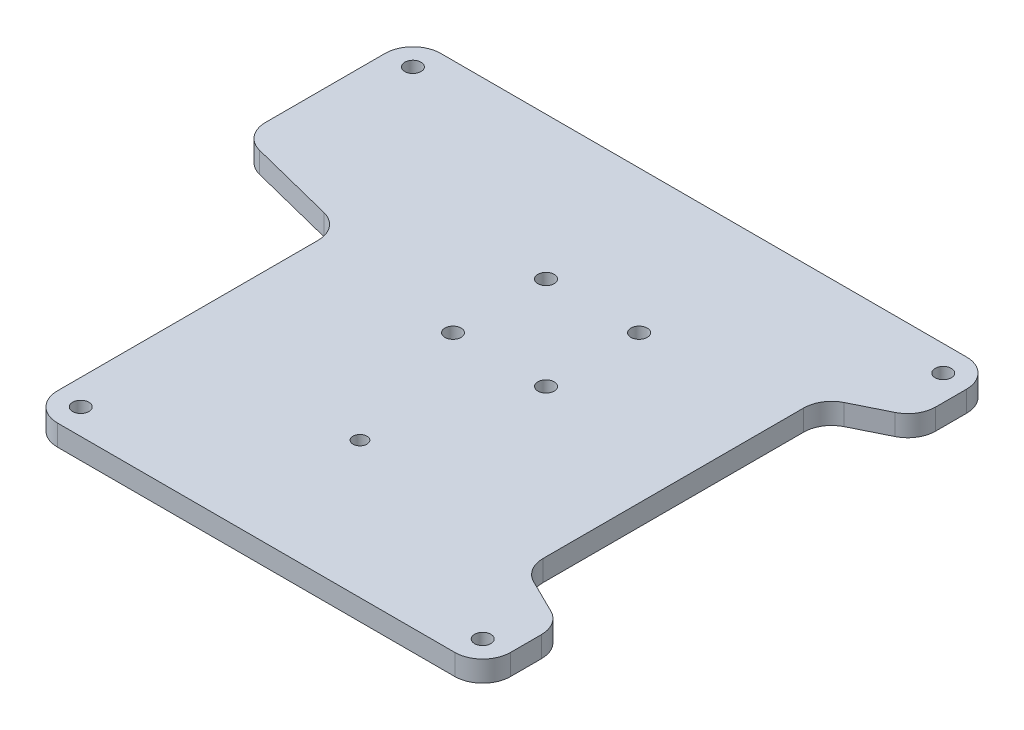
ISO-10303-21;
HEADER;
FILE_DESCRIPTION(('STEP AP214'),'2;1');
FILE_NAME('part.step','',(''),(''),'','','');
FILE_SCHEMA(('AUTOMOTIVE_DESIGN { 1 0 10303 214 1 1 1 1 }'));
ENDSEC;
DATA;
#1=APPLICATION_CONTEXT('core data for automotive mechanical design processes');
#2=APPLICATION_PROTOCOL_DEFINITION('international standard','automotive_design',2000,#1);
#3=PRODUCT_CONTEXT('',#1,'mechanical');
#4=PRODUCT('Part','Part','',(#3));
#5=PRODUCT_RELATED_PRODUCT_CATEGORY('part','',(#4));
#6=PRODUCT_DEFINITION_FORMATION('','',#4);
#7=PRODUCT_DEFINITION_CONTEXT('part definition',#1,'design');
#8=PRODUCT_DEFINITION('design','',#6,#7);
#9=PRODUCT_DEFINITION_SHAPE('','',#8);
#10=(LENGTH_UNIT() NAMED_UNIT(*) SI_UNIT(.MILLI.,.METRE.));
#11=(NAMED_UNIT(*) PLANE_ANGLE_UNIT() SI_UNIT($,.RADIAN.));
#12=(NAMED_UNIT(*) SI_UNIT($,.STERADIAN.) SOLID_ANGLE_UNIT());
#13=UNCERTAINTY_MEASURE_WITH_UNIT(LENGTH_MEASURE(1.E-05),#10,'distance_accuracy_value','');
#14=(GEOMETRIC_REPRESENTATION_CONTEXT(3) GLOBAL_UNCERTAINTY_ASSIGNED_CONTEXT((#13)) GLOBAL_UNIT_ASSIGNED_CONTEXT((#10,
#11,#12)) REPRESENTATION_CONTEXT('',''));
#15=CARTESIAN_POINT('',(0.,0.,0.));
#16=DIRECTION('',(0.,0.,1.));
#17=DIRECTION('',(1.,0.,0.));
#18=AXIS2_PLACEMENT_3D('',#15,#16,#17);
#19=CARTESIAN_POINT('',(-35.7,4.5,49.));
#20=DIRECTION('',(0.,1.,0.));
#21=DIRECTION('',(0.,0.,1.));
#22=AXIS2_PLACEMENT_3D('',#19,#20,#21);
#23=PLANE('',#22);
#24=CARTESIAN_POINT('',(10.,4.5,-24.3180573966395));
#25=DIRECTION('',(0.,1.,0.));
#26=DIRECTION('',(0.,0.,1.));
#27=AXIS2_PLACEMENT_3D('',#24,#25,#26);
#28=CIRCLE('',#27,1.75);
#29=CARTESIAN_POINT('',(10.,4.5,-22.5680573966395));
#30=VERTEX_POINT('',#29);
#31=EDGE_CURVE('E523',#30,#30,#28,.T.);
#32=ORIENTED_EDGE('',*,*,#31,.F.);
#33=EDGE_LOOP('',(#32));
#34=FACE_BOUND('',#33,.T.);
#35=CARTESIAN_POINT('',(-10.,4.5,-4.31805739663951));
#36=DIRECTION('',(0.,1.,0.));
#37=DIRECTION('',(0.,0.,1.));
#38=AXIS2_PLACEMENT_3D('',#35,#36,#37);
#39=CIRCLE('',#38,1.75);
#40=CARTESIAN_POINT('',(-10.,4.5,-2.56805739663951));
#41=VERTEX_POINT('',#40);
#42=EDGE_CURVE('E539',#41,#41,#39,.T.);
#43=ORIENTED_EDGE('',*,*,#42,.F.);
#44=EDGE_LOOP('',(#43));
#45=FACE_BOUND('',#44,.T.);
#46=CARTESIAN_POINT('',(50.2,4.5,-49.5));
#47=DIRECTION('',(0.,1.,0.));
#48=DIRECTION('',(0.,0.,1.));
#49=AXIS2_PLACEMENT_3D('',#46,#47,#48);
#50=CIRCLE('',#49,1.75);
#51=CARTESIAN_POINT('',(50.2,4.5,-47.75));
#52=VERTEX_POINT('',#51);
#53=EDGE_CURVE('E554',#52,#52,#50,.T.);
#54=ORIENTED_EDGE('',*,*,#53,.F.);
#55=EDGE_LOOP('',(#54));
#56=FACE_BOUND('',#55,.T.);
#57=CARTESIAN_POINT('',(50.2,4.5,49.5));
#58=DIRECTION('',(0.,1.,0.));
#59=DIRECTION('',(0.,0.,1.));
#60=AXIS2_PLACEMENT_3D('',#57,#58,#59);
#61=CIRCLE('',#60,1.75);
#62=CARTESIAN_POINT('',(50.2,4.5,51.25));
#63=VERTEX_POINT('',#62);
#64=EDGE_CURVE('E570',#63,#63,#61,.T.);
#65=ORIENTED_EDGE('',*,*,#64,.F.);
#66=EDGE_LOOP('',(#65));
#67=FACE_BOUND('',#66,.T.);
#68=CARTESIAN_POINT('',(-35.7,4.5,49.));
#69=DIRECTION('',(0.,1.,0.));
#70=DIRECTION('',(0.,0.,1.));
#71=AXIS2_PLACEMENT_3D('',#68,#69,#70);
#72=CIRCLE('',#71,6.00000000000001);
#73=CARTESIAN_POINT('',(-41.7,4.5,49.));
#74=VERTEX_POINT('',#73);
#75=CARTESIAN_POINT('',(-35.7,4.5,55.));
#76=VERTEX_POINT('',#75);
#77=EDGE_CURVE('E312',#74,#76,#72,.T.);
#78=ORIENTED_EDGE('',*,*,#77,.T.);
#79=DIRECTION('',(1.,0.,0.));
#80=VECTOR('',#79,1.);
#81=CARTESIAN_POINT('',(-35.7,4.5,55.));
#82=LINE('',#81,#80);
#83=CARTESIAN_POINT('',(49.7,4.5,55.));
#84=VERTEX_POINT('',#83);
#85=EDGE_CURVE('E162',#76,#84,#82,.T.);
#86=ORIENTED_EDGE('',*,*,#85,.T.);
#87=CARTESIAN_POINT('',(49.7,4.5,49.));
#88=DIRECTION('',(0.,1.,0.));
#89=DIRECTION('',(0.,0.,1.));
#90=AXIS2_PLACEMENT_3D('',#87,#88,#89);
#91=CIRCLE('',#90,5.99999999999999);
#92=CARTESIAN_POINT('',(55.7,4.5,49.));
#93=VERTEX_POINT('',#92);
#94=EDGE_CURVE('E383',#84,#93,#91,.T.);
#95=ORIENTED_EDGE('',*,*,#94,.T.);
#96=DIRECTION('',(0.,0.,-1.));
#97=VECTOR('',#96,1.);
#98=CARTESIAN_POINT('',(55.7,4.5,49.));
#99=LINE('',#98,#97);
#100=CARTESIAN_POINT('',(55.7,4.5,42.3778187247569));
#101=VERTEX_POINT('',#100);
#102=EDGE_CURVE('E403',#93,#101,#99,.T.);
#103=ORIENTED_EDGE('',*,*,#102,.T.);
#104=CARTESIAN_POINT('',(49.7,4.5,42.3778187247569));
#105=DIRECTION('',(0.,1.,0.));
#106=DIRECTION('',(0.,0.,1.));
#107=AXIS2_PLACEMENT_3D('',#104,#105,#106);
#108=CIRCLE('',#107,6.);
#109=CARTESIAN_POINT('',(52.3606513795788,4.5,37.));
#110=VERTEX_POINT('',#109);
#111=EDGE_CURVE('E399',#101,#110,#108,.T.);
#112=ORIENTED_EDGE('',*,*,#111,.T.);
#113=DIRECTION('',(-0.896303120792812,0.,-0.443441896596461));
#114=VECTOR('',#113,1.);
#115=CARTESIAN_POINT('',(52.3606513795788,4.5,37.));
#116=LINE('',#115,#114);
#117=CARTESIAN_POINT('',(45.0393486204213,4.5,33.3778187247569));
#118=VERTEX_POINT('',#117);
#119=EDGE_CURVE('E402',#110,#118,#116,.T.);
#120=ORIENTED_EDGE('',*,*,#119,.T.);
#121=CARTESIAN_POINT('',(47.7,4.5,28.));
#122=DIRECTION('',(0.,-1.,0.));
#123=DIRECTION('',(0.,0.,-1.));
#124=AXIS2_PLACEMENT_3D('',#121,#122,#123);
#125=CIRCLE('',#124,6.00000000000001);
#126=CARTESIAN_POINT('',(41.7,4.5,28.));
#127=VERTEX_POINT('',#126);
#128=EDGE_CURVE('E406',#118,#127,#125,.T.);
#129=ORIENTED_EDGE('',*,*,#128,.T.);
#130=DIRECTION('',(0.,0.,-1.));
#131=VECTOR('',#130,1.);
#132=CARTESIAN_POINT('',(41.7,4.5,28.));
#133=LINE('',#132,#131);
#134=CARTESIAN_POINT('',(41.7,4.5,-28.));
#135=VERTEX_POINT('',#134);
#136=EDGE_CURVE('E414',#127,#135,#133,.T.);
#137=ORIENTED_EDGE('',*,*,#136,.T.);
#138=CARTESIAN_POINT('',(47.7,4.5,-28.));
#139=DIRECTION('',(0.,-1.,0.));
#140=DIRECTION('',(0.,0.,-1.));
#141=AXIS2_PLACEMENT_3D('',#138,#139,#140);
#142=CIRCLE('',#141,6.);
#143=CARTESIAN_POINT('',(45.0393486204212,4.5,-33.3778187247569));
#144=VERTEX_POINT('',#143);
#145=EDGE_CURVE('E417',#135,#144,#142,.T.);
#146=ORIENTED_EDGE('',*,*,#145,.T.);
#147=DIRECTION('',(0.896303120792812,0.,-0.443441896596461));
#148=VECTOR('',#147,1.);
#149=CARTESIAN_POINT('',(45.0393486204213,4.5,-33.3778187247569));
#150=LINE('',#149,#148);
#151=CARTESIAN_POINT('',(52.3606513795788,4.5,-37.));
#152=VERTEX_POINT('',#151);
#153=EDGE_CURVE('E420',#144,#152,#150,.T.);
#154=ORIENTED_EDGE('',*,*,#153,.T.);
#155=CARTESIAN_POINT('',(49.7,4.5,-42.3778187247569));
#156=DIRECTION('',(0.,1.,0.));
#157=DIRECTION('',(0.,0.,1.));
#158=AXIS2_PLACEMENT_3D('',#155,#156,#157);
#159=CIRCLE('',#158,6.);
#160=CARTESIAN_POINT('',(55.7,4.5,-42.3778187247569));
#161=VERTEX_POINT('',#160);
#162=EDGE_CURVE('E423',#152,#161,#159,.T.);
#163=ORIENTED_EDGE('',*,*,#162,.T.);
#164=DIRECTION('',(0.,0.,-1.));
#165=VECTOR('',#164,1.);
#166=CARTESIAN_POINT('',(55.7,4.5,-42.3778187247569));
#167=LINE('',#166,#165);
#168=CARTESIAN_POINT('',(55.7,4.5,-49.));
#169=VERTEX_POINT('',#168);
#170=EDGE_CURVE('E426',#161,#169,#167,.T.);
#171=ORIENTED_EDGE('',*,*,#170,.T.);
#172=CARTESIAN_POINT('',(49.7,4.5,-49.));
#173=DIRECTION('',(0.,1.,0.));
#174=DIRECTION('',(0.,0.,1.));
#175=AXIS2_PLACEMENT_3D('',#172,#173,#174);
#176=CIRCLE('',#175,6.);
#177=CARTESIAN_POINT('',(49.7,4.5,-55.));
#178=VERTEX_POINT('',#177);
#179=EDGE_CURVE('E429',#169,#178,#176,.T.);
#180=ORIENTED_EDGE('',*,*,#179,.T.);
#181=DIRECTION('',(-1.,0.,0.));
#182=VECTOR('',#181,1.);
#183=CARTESIAN_POINT('',(49.7,4.5,-55.));
#184=LINE('',#183,#182);
#185=CARTESIAN_POINT('',(-63.3,4.5,-55.));
#186=VERTEX_POINT('',#185);
#187=EDGE_CURVE('E432',#178,#186,#184,.T.);
#188=ORIENTED_EDGE('',*,*,#187,.T.);
#189=CARTESIAN_POINT('',(-63.3,4.5,-49.));
#190=DIRECTION('',(0.,1.,0.));
#191=DIRECTION('',(0.,0.,1.));
#192=AXIS2_PLACEMENT_3D('',#189,#190,#191);
#193=CIRCLE('',#192,6.00000000000001);
#194=CARTESIAN_POINT('',(-69.3,4.5,-49.));
#195=VERTEX_POINT('',#194);
#196=EDGE_CURVE('E435',#186,#195,#193,.T.);
#197=ORIENTED_EDGE('',*,*,#196,.T.);
#198=DIRECTION('',(0.,0.,1.));
#199=VECTOR('',#198,1.);
#200=CARTESIAN_POINT('',(-69.3,4.5,-49.));
#201=LINE('',#200,#199);
#202=CARTESIAN_POINT('',(-69.3,4.5,-23.317292810075));
#203=VERTEX_POINT('',#202);
#204=EDGE_CURVE('E438',#195,#203,#201,.T.);
#205=ORIENTED_EDGE('',*,*,#204,.T.);
#206=CARTESIAN_POINT('',(-63.3,4.5,-23.317292810075));
#207=DIRECTION('',(0.,1.,0.));
#208=DIRECTION('',(0.,0.,1.));
#209=AXIS2_PLACEMENT_3D('',#206,#207,#208);
#210=CIRCLE('',#209,6.);
#211=CARTESIAN_POINT('',(-64.7693891117909,4.5,-17.5));
#212=VERTEX_POINT('',#211);
#213=EDGE_CURVE('E231',#203,#212,#210,.T.);
#214=ORIENTED_EDGE('',*,*,#213,.T.);
#215=DIRECTION('',(0.969548801679168,0.,0.244898185298482));
#216=VECTOR('',#215,1.);
#217=CARTESIAN_POINT('',(-64.7693891117909,4.5,-17.5));
#218=LINE('',#217,#216);
#219=CARTESIAN_POINT('',(-46.2306108882091,4.5,-12.817292810075));
#220=VERTEX_POINT('',#219);
#221=EDGE_CURVE('E225',#212,#220,#218,.T.);
#222=ORIENTED_EDGE('',*,*,#221,.T.);
#223=CARTESIAN_POINT('',(-47.7,4.5,-6.99999999999999));
#224=DIRECTION('',(0.,-1.,0.));
#225=DIRECTION('',(0.,0.,-1.));
#226=AXIS2_PLACEMENT_3D('',#223,#224,#225);
#227=CIRCLE('',#226,6.);
#228=CARTESIAN_POINT('',(-41.7,4.5,-6.99999999999999));
#229=VERTEX_POINT('',#228);
#230=EDGE_CURVE('E229',#220,#229,#227,.T.);
#231=ORIENTED_EDGE('',*,*,#230,.T.);
#232=DIRECTION('',(0.,0.,1.));
#233=VECTOR('',#232,1.);
#234=CARTESIAN_POINT('',(-41.7,4.5,-6.99999999999999));
#235=LINE('',#234,#233);
#236=EDGE_CURVE('E60',#229,#74,#235,.T.);
#237=ORIENTED_EDGE('',*,*,#236,.T.);
#238=EDGE_LOOP('',(#78,#86,#95,#103,#112,#120,#129,#137,#146,#154,#163,#171,#180,#188,#197,#205,
#214,#222,#231,#237));
#239=FACE_BOUND('',#238,.T.);
#240=CARTESIAN_POINT('',(-36.2,4.5,49.5));
#241=DIRECTION('',(0.,1.,0.));
#242=DIRECTION('',(0.,0.,1.));
#243=AXIS2_PLACEMENT_3D('',#240,#241,#242);
#244=CIRCLE('',#243,1.75);
#245=CARTESIAN_POINT('',(-36.2,4.5,51.25));
#246=VERTEX_POINT('',#245);
#247=EDGE_CURVE('E260',#246,#246,#244,.T.);
#248=ORIENTED_EDGE('',*,*,#247,.F.);
#249=EDGE_LOOP('',(#248));
#250=FACE_BOUND('',#249,.T.);
#251=CARTESIAN_POINT('',(-63.8,4.5,-49.5));
#252=DIRECTION('',(0.,1.,0.));
#253=DIRECTION('',(0.,0.,1.));
#254=AXIS2_PLACEMENT_3D('',#251,#252,#253);
#255=CIRCLE('',#254,1.75);
#256=CARTESIAN_POINT('',(-63.8,4.5,-47.75));
#257=VERTEX_POINT('',#256);
#258=EDGE_CURVE('E562',#257,#257,#255,.T.);
#259=ORIENTED_EDGE('',*,*,#258,.F.);
#260=EDGE_LOOP('',(#259));
#261=FACE_BOUND('',#260,.T.);
#262=CARTESIAN_POINT('',(-10.,4.5,-24.3180573966395));
#263=DIRECTION('',(0.,1.,0.));
#264=DIRECTION('',(0.,0.,1.));
#265=AXIS2_PLACEMENT_3D('',#262,#263,#264);
#266=CIRCLE('',#265,1.75);
#267=CARTESIAN_POINT('',(-10.,4.5,-22.5680573966395));
#268=VERTEX_POINT('',#267);
#269=EDGE_CURVE('E547',#268,#268,#266,.T.);
#270=ORIENTED_EDGE('',*,*,#269,.F.);
#271=EDGE_LOOP('',(#270));
#272=FACE_BOUND('',#271,.T.);
#273=CARTESIAN_POINT('',(10.,4.5,-4.31805739663951));
#274=DIRECTION('',(0.,1.,0.));
#275=DIRECTION('',(0.,0.,1.));
#276=AXIS2_PLACEMENT_3D('',#273,#274,#275);
#277=CIRCLE('',#276,1.75);
#278=CARTESIAN_POINT('',(10.,4.5,-2.56805739663951));
#279=VERTEX_POINT('',#278);
#280=EDGE_CURVE('E531',#279,#279,#277,.T.);
#281=ORIENTED_EDGE('',*,*,#280,.F.);
#282=EDGE_LOOP('',(#281));
#283=FACE_BOUND('',#282,.T.);
#284=CARTESIAN_POINT('',(0.,4.5,25.6819426033605));
#285=DIRECTION('',(0.,1.,0.));
#286=DIRECTION('',(0.,0.,1.));
#287=AXIS2_PLACEMENT_3D('',#284,#285,#286);
#288=CIRCLE('',#287,1.5);
#289=CARTESIAN_POINT('',(0.,4.5,27.1819426033605));
#290=VERTEX_POINT('',#289);
#291=EDGE_CURVE('E512',#290,#290,#288,.T.);
#292=ORIENTED_EDGE('',*,*,#291,.F.);
#293=EDGE_LOOP('',(#292));
#294=FACE_BOUND('',#293,.T.);
#295=ADVANCED_FACE('F39',(#34,#45,#56,#67,#239,#250,#261,#272,#283,#294),#23,.T.);
#296=CARTESIAN_POINT('',(-35.7,0.,49.));
#297=DIRECTION('',(0.,1.,0.));
#298=DIRECTION('',(0.,0.,1.));
#299=AXIS2_PLACEMENT_3D('',#296,#297,#298);
#300=PLANE('',#299);
#301=CARTESIAN_POINT('',(-35.7,0.,49.));
#302=DIRECTION('',(0.,1.,0.));
#303=DIRECTION('',(0.,0.,1.));
#304=AXIS2_PLACEMENT_3D('',#301,#302,#303);
#305=CIRCLE('',#304,6.00000000000001);
#306=CARTESIAN_POINT('',(-41.7,0.,49.));
#307=VERTEX_POINT('',#306);
#308=CARTESIAN_POINT('',(-35.7,0.,55.));
#309=VERTEX_POINT('',#308);
#310=EDGE_CURVE('E255',#307,#309,#305,.T.);
#311=ORIENTED_EDGE('',*,*,#310,.F.);
#312=DIRECTION('',(0.,0.,1.));
#313=VECTOR('',#312,1.);
#314=CARTESIAN_POINT('',(-41.7,0.,-6.99999999999999));
#315=LINE('',#314,#313);
#316=CARTESIAN_POINT('',(-41.7,0.,-6.99999999999999));
#317=VERTEX_POINT('',#316);
#318=EDGE_CURVE('E154',#317,#307,#315,.T.);
#319=ORIENTED_EDGE('',*,*,#318,.F.);
#320=CARTESIAN_POINT('',(-47.7,0.,-6.99999999999999));
#321=DIRECTION('',(0.,-1.,0.));
#322=DIRECTION('',(0.,0.,-1.));
#323=AXIS2_PLACEMENT_3D('',#320,#321,#322);
#324=CIRCLE('',#323,6.);
#325=CARTESIAN_POINT('',(-46.2306108882091,0.,-12.817292810075));
#326=VERTEX_POINT('',#325);
#327=EDGE_CURVE('E145',#326,#317,#324,.T.);
#328=ORIENTED_EDGE('',*,*,#327,.F.);
#329=DIRECTION('',(0.969548801679168,0.,0.244898185298482));
#330=VECTOR('',#329,1.);
#331=CARTESIAN_POINT('',(-64.7693891117909,0.,-17.5));
#332=LINE('',#331,#330);
#333=CARTESIAN_POINT('',(-64.7693891117909,0.,-17.5));
#334=VERTEX_POINT('',#333);
#335=EDGE_CURVE('E240',#334,#326,#332,.T.);
#336=ORIENTED_EDGE('',*,*,#335,.F.);
#337=CARTESIAN_POINT('',(-63.3,0.,-23.317292810075));
#338=DIRECTION('',(0.,1.,0.));
#339=DIRECTION('',(0.,0.,1.));
#340=AXIS2_PLACEMENT_3D('',#337,#338,#339);
#341=CIRCLE('',#340,6.);
#342=CARTESIAN_POINT('',(-69.3,0.,-23.317292810075));
#343=VERTEX_POINT('',#342);
#344=EDGE_CURVE('E304',#343,#334,#341,.T.);
#345=ORIENTED_EDGE('',*,*,#344,.F.);
#346=DIRECTION('',(0.,0.,1.));
#347=VECTOR('',#346,1.);
#348=CARTESIAN_POINT('',(-69.3,0.,-49.));
#349=LINE('',#348,#347);
#350=CARTESIAN_POINT('',(-69.3,0.,-49.));
#351=VERTEX_POINT('',#350);
#352=EDGE_CURVE('E302',#351,#343,#349,.T.);
#353=ORIENTED_EDGE('',*,*,#352,.F.);
#354=CARTESIAN_POINT('',(-63.3,0.,-49.));
#355=DIRECTION('',(0.,1.,0.));
#356=DIRECTION('',(0.,0.,1.));
#357=AXIS2_PLACEMENT_3D('',#354,#355,#356);
#358=CIRCLE('',#357,6.00000000000001);
#359=CARTESIAN_POINT('',(-63.3,0.,-55.));
#360=VERTEX_POINT('',#359);
#361=EDGE_CURVE('E299',#360,#351,#358,.T.);
#362=ORIENTED_EDGE('',*,*,#361,.F.);
#363=DIRECTION('',(-1.,0.,0.));
#364=VECTOR('',#363,1.);
#365=CARTESIAN_POINT('',(49.7,0.,-55.));
#366=LINE('',#365,#364);
#367=CARTESIAN_POINT('',(49.7,0.,-55.));
#368=VERTEX_POINT('',#367);
#369=EDGE_CURVE('E296',#368,#360,#366,.T.);
#370=ORIENTED_EDGE('',*,*,#369,.F.);
#371=CARTESIAN_POINT('',(49.7,0.,-49.));
#372=DIRECTION('',(0.,1.,0.));
#373=DIRECTION('',(0.,0.,1.));
#374=AXIS2_PLACEMENT_3D('',#371,#372,#373);
#375=CIRCLE('',#374,6.);
#376=CARTESIAN_POINT('',(55.7,0.,-49.));
#377=VERTEX_POINT('',#376);
#378=EDGE_CURVE('E293',#377,#368,#375,.T.);
#379=ORIENTED_EDGE('',*,*,#378,.F.);
#380=DIRECTION('',(0.,0.,-1.));
#381=VECTOR('',#380,1.);
#382=CARTESIAN_POINT('',(55.7,0.,-42.3778187247569));
#383=LINE('',#382,#381);
#384=CARTESIAN_POINT('',(55.7,0.,-42.3778187247569));
#385=VERTEX_POINT('',#384);
#386=EDGE_CURVE('E290',#385,#377,#383,.T.);
#387=ORIENTED_EDGE('',*,*,#386,.F.);
#388=CARTESIAN_POINT('',(49.7,0.,-42.3778187247569));
#389=DIRECTION('',(0.,1.,0.));
#390=DIRECTION('',(0.,0.,1.));
#391=AXIS2_PLACEMENT_3D('',#388,#389,#390);
#392=CIRCLE('',#391,6.);
#393=CARTESIAN_POINT('',(52.3606513795788,0.,-37.));
#394=VERTEX_POINT('',#393);
#395=EDGE_CURVE('E287',#394,#385,#392,.T.);
#396=ORIENTED_EDGE('',*,*,#395,.F.);
#397=DIRECTION('',(0.896303120792812,0.,-0.443441896596461));
#398=VECTOR('',#397,1.);
#399=CARTESIAN_POINT('',(45.0393486204213,0.,-33.3778187247569));
#400=LINE('',#399,#398);
#401=CARTESIAN_POINT('',(45.0393486204212,0.,-33.3778187247569));
#402=VERTEX_POINT('',#401);
#403=EDGE_CURVE('E284',#402,#394,#400,.T.);
#404=ORIENTED_EDGE('',*,*,#403,.F.);
#405=CARTESIAN_POINT('',(47.7,0.,-28.));
#406=DIRECTION('',(0.,-1.,0.));
#407=DIRECTION('',(0.,0.,-1.));
#408=AXIS2_PLACEMENT_3D('',#405,#406,#407);
#409=CIRCLE('',#408,6.);
#410=CARTESIAN_POINT('',(41.7,0.,-28.));
#411=VERTEX_POINT('',#410);
#412=EDGE_CURVE('E281',#411,#402,#409,.T.);
#413=ORIENTED_EDGE('',*,*,#412,.F.);
#414=DIRECTION('',(0.,0.,-1.));
#415=VECTOR('',#414,1.);
#416=CARTESIAN_POINT('',(41.7,0.,28.));
#417=LINE('',#416,#415);
#418=CARTESIAN_POINT('',(41.7,0.,28.));
#419=VERTEX_POINT('',#418);
#420=EDGE_CURVE('E278',#419,#411,#417,.T.);
#421=ORIENTED_EDGE('',*,*,#420,.F.);
#422=CARTESIAN_POINT('',(47.7,0.,28.));
#423=DIRECTION('',(0.,-1.,0.));
#424=DIRECTION('',(0.,0.,-1.));
#425=AXIS2_PLACEMENT_3D('',#422,#423,#424);
#426=CIRCLE('',#425,6.00000000000001);
#427=CARTESIAN_POINT('',(45.0393486204213,0.,33.3778187247569));
#428=VERTEX_POINT('',#427);
#429=EDGE_CURVE('E275',#428,#419,#426,.T.);
#430=ORIENTED_EDGE('',*,*,#429,.F.);
#431=DIRECTION('',(-0.896303120792812,0.,-0.443441896596461));
#432=VECTOR('',#431,1.);
#433=CARTESIAN_POINT('',(52.3606513795788,0.,37.));
#434=LINE('',#433,#432);
#435=CARTESIAN_POINT('',(52.3606513795788,0.,37.));
#436=VERTEX_POINT('',#435);
#437=EDGE_CURVE('E272',#436,#428,#434,.T.);
#438=ORIENTED_EDGE('',*,*,#437,.F.);
#439=CARTESIAN_POINT('',(49.7,0.,42.3778187247569));
#440=DIRECTION('',(0.,1.,0.));
#441=DIRECTION('',(0.,0.,1.));
#442=AXIS2_PLACEMENT_3D('',#439,#440,#441);
#443=CIRCLE('',#442,6.);
#444=CARTESIAN_POINT('',(55.7,0.,42.3778187247569));
#445=VERTEX_POINT('',#444);
#446=EDGE_CURVE('E269',#445,#436,#443,.T.);
#447=ORIENTED_EDGE('',*,*,#446,.F.);
#448=DIRECTION('',(0.,0.,-1.));
#449=VECTOR('',#448,1.);
#450=CARTESIAN_POINT('',(55.7,0.,49.));
#451=LINE('',#450,#449);
#452=CARTESIAN_POINT('',(55.7,0.,49.));
#453=VERTEX_POINT('',#452);
#454=EDGE_CURVE('E266',#453,#445,#451,.T.);
#455=ORIENTED_EDGE('',*,*,#454,.F.);
#456=CARTESIAN_POINT('',(49.7,0.,49.));
#457=DIRECTION('',(0.,1.,0.));
#458=DIRECTION('',(0.,0.,1.));
#459=AXIS2_PLACEMENT_3D('',#456,#457,#458);
#460=CIRCLE('',#459,5.99999999999999);
#461=CARTESIAN_POINT('',(49.7,0.,55.));
#462=VERTEX_POINT('',#461);
#463=EDGE_CURVE('E263',#462,#453,#460,.T.);
#464=ORIENTED_EDGE('',*,*,#463,.F.);
#465=DIRECTION('',(1.,0.,0.));
#466=VECTOR('',#465,1.);
#467=CARTESIAN_POINT('',(-35.7,0.,55.));
#468=LINE('',#467,#466);
#469=EDGE_CURVE('E259',#309,#462,#468,.T.);
#470=ORIENTED_EDGE('',*,*,#469,.F.);
#471=EDGE_LOOP('',(#311,#319,#328,#336,#345,#353,#362,#370,#379,#387,#396,#404,#413,#421,#430,
#438,#447,#455,#464,#470));
#472=FACE_BOUND('',#471,.T.);
#473=CARTESIAN_POINT('',(-36.2,0.,49.5));
#474=DIRECTION('',(0.,1.,0.));
#475=DIRECTION('',(0.,0.,1.));
#476=AXIS2_PLACEMENT_3D('',#473,#474,#475);
#477=CIRCLE('',#476,1.75);
#478=CARTESIAN_POINT('',(-36.2,0.,51.25));
#479=VERTEX_POINT('',#478);
#480=EDGE_CURVE('E573',#479,#479,#477,.T.);
#481=ORIENTED_EDGE('',*,*,#480,.T.);
#482=EDGE_LOOP('',(#481));
#483=FACE_BOUND('',#482,.T.);
#484=CARTESIAN_POINT('',(50.2,0.,49.5));
#485=DIRECTION('',(0.,1.,0.));
#486=DIRECTION('',(0.,0.,1.));
#487=AXIS2_PLACEMENT_3D('',#484,#485,#486);
#488=CIRCLE('',#487,1.75);
#489=CARTESIAN_POINT('',(50.2,0.,51.25));
#490=VERTEX_POINT('',#489);
#491=EDGE_CURVE('E566',#490,#490,#488,.T.);
#492=ORIENTED_EDGE('',*,*,#491,.T.);
#493=EDGE_LOOP('',(#492));
#494=FACE_BOUND('',#493,.T.);
#495=CARTESIAN_POINT('',(-63.8,0.,-49.5));
#496=DIRECTION('',(0.,1.,0.));
#497=DIRECTION('',(0.,0.,1.));
#498=AXIS2_PLACEMENT_3D('',#495,#496,#497);
#499=CIRCLE('',#498,1.75);
#500=CARTESIAN_POINT('',(-63.8,0.,-47.75));
#501=VERTEX_POINT('',#500);
#502=EDGE_CURVE('E558',#501,#501,#499,.T.);
#503=ORIENTED_EDGE('',*,*,#502,.T.);
#504=EDGE_LOOP('',(#503));
#505=FACE_BOUND('',#504,.T.);
#506=CARTESIAN_POINT('',(50.2,0.,-49.5));
#507=DIRECTION('',(0.,1.,0.));
#508=DIRECTION('',(0.,0.,1.));
#509=AXIS2_PLACEMENT_3D('',#506,#507,#508);
#510=CIRCLE('',#509,1.75);
#511=CARTESIAN_POINT('',(50.2,0.,-47.75));
#512=VERTEX_POINT('',#511);
#513=EDGE_CURVE('E550',#512,#512,#510,.T.);
#514=ORIENTED_EDGE('',*,*,#513,.T.);
#515=EDGE_LOOP('',(#514));
#516=FACE_BOUND('',#515,.T.);
#517=CARTESIAN_POINT('',(-10.,0.,-24.3180573966395));
#518=DIRECTION('',(0.,1.,0.));
#519=DIRECTION('',(0.,0.,1.));
#520=AXIS2_PLACEMENT_3D('',#517,#518,#519);
#521=CIRCLE('',#520,1.75);
#522=CARTESIAN_POINT('',(-10.,0.,-22.5680573966395));
#523=VERTEX_POINT('',#522);
#524=EDGE_CURVE('E543',#523,#523,#521,.T.);
#525=ORIENTED_EDGE('',*,*,#524,.T.);
#526=EDGE_LOOP('',(#525));
#527=FACE_BOUND('',#526,.T.);
#528=CARTESIAN_POINT('',(-10.,0.,-4.31805739663951));
#529=DIRECTION('',(0.,1.,0.));
#530=DIRECTION('',(0.,0.,1.));
#531=AXIS2_PLACEMENT_3D('',#528,#529,#530);
#532=CIRCLE('',#531,1.75);
#533=CARTESIAN_POINT('',(-10.,0.,-2.56805739663951));
#534=VERTEX_POINT('',#533);
#535=EDGE_CURVE('E535',#534,#534,#532,.T.);
#536=ORIENTED_EDGE('',*,*,#535,.T.);
#537=EDGE_LOOP('',(#536));
#538=FACE_BOUND('',#537,.T.);
#539=CARTESIAN_POINT('',(10.,0.,-4.31805739663951));
#540=DIRECTION('',(0.,1.,0.));
#541=DIRECTION('',(0.,0.,1.));
#542=AXIS2_PLACEMENT_3D('',#539,#540,#541);
#543=CIRCLE('',#542,1.75);
#544=CARTESIAN_POINT('',(10.,0.,-2.56805739663951));
#545=VERTEX_POINT('',#544);
#546=EDGE_CURVE('E527',#545,#545,#543,.T.);
#547=ORIENTED_EDGE('',*,*,#546,.T.);
#548=EDGE_LOOP('',(#547));
#549=FACE_BOUND('',#548,.T.);
#550=CARTESIAN_POINT('',(10.,0.,-24.3180573966395));
#551=DIRECTION('',(0.,1.,0.));
#552=DIRECTION('',(0.,0.,1.));
#553=AXIS2_PLACEMENT_3D('',#550,#551,#552);
#554=CIRCLE('',#553,1.75);
#555=CARTESIAN_POINT('',(10.,0.,-22.5680573966395));
#556=VERTEX_POINT('',#555);
#557=EDGE_CURVE('E520',#556,#556,#554,.T.);
#558=ORIENTED_EDGE('',*,*,#557,.T.);
#559=EDGE_LOOP('',(#558));
#560=FACE_BOUND('',#559,.T.);
#561=CARTESIAN_POINT('',(0.,0.,25.6819426033605));
#562=DIRECTION('',(0.,1.,0.));
#563=DIRECTION('',(0.,0.,1.));
#564=AXIS2_PLACEMENT_3D('',#561,#562,#563);
#565=CIRCLE('',#564,1.5);
#566=CARTESIAN_POINT('',(0.,0.,27.1819426033605));
#567=VERTEX_POINT('',#566);
#568=EDGE_CURVE('E515',#567,#567,#565,.T.);
#569=ORIENTED_EDGE('',*,*,#568,.T.);
#570=EDGE_LOOP('',(#569));
#571=FACE_BOUND('',#570,.T.);
#572=ADVANCED_FACE('F387',(#472,#483,#494,#505,#516,#527,#538,#549,#560,#571),#300,.F.);
#573=CARTESIAN_POINT('',(-35.7,4.5,49.));
#574=DIRECTION('',(0.,-1.,0.));
#575=DIRECTION('',(0.,0.,-1.));
#576=AXIS2_PLACEMENT_3D('',#573,#574,#575);
#577=CYLINDRICAL_SURFACE('',#576,6.00000000000001);
#578=ORIENTED_EDGE('',*,*,#310,.T.);
#579=DIRECTION('',(0.,-1.,0.));
#580=VECTOR('',#579,1.);
#581=CARTESIAN_POINT('',(-35.7,4.5,55.));
#582=LINE('',#581,#580);
#583=EDGE_CURVE('E11',#76,#309,#582,.T.);
#584=ORIENTED_EDGE('',*,*,#583,.F.);
#585=ORIENTED_EDGE('',*,*,#77,.F.);
#586=DIRECTION('',(0.,-1.,0.));
#587=VECTOR('',#586,1.);
#588=CARTESIAN_POINT('',(-41.7,4.5,49.));
#589=LINE('',#588,#587);
#590=EDGE_CURVE('E251',#74,#307,#589,.T.);
#591=ORIENTED_EDGE('',*,*,#590,.T.);
#592=EDGE_LOOP('',(#578,#584,#585,#591));
#593=FACE_BOUND('',#592,.T.);
#594=ADVANCED_FACE('F41',(#593),#577,.T.);
#595=CARTESIAN_POINT('',(-35.7,4.5,55.));
#596=DIRECTION('',(0.,0.,-1.));
#597=DIRECTION('',(-1.,0.,0.));
#598=AXIS2_PLACEMENT_3D('',#595,#596,#597);
#599=PLANE('',#598);
#600=ORIENTED_EDGE('',*,*,#469,.T.);
#601=DIRECTION('',(0.,-1.,0.));
#602=VECTOR('',#601,1.);
#603=CARTESIAN_POINT('',(49.7,4.5,55.));
#604=LINE('',#603,#602);
#605=EDGE_CURVE('E49',#84,#462,#604,.T.);
#606=ORIENTED_EDGE('',*,*,#605,.F.);
#607=ORIENTED_EDGE('',*,*,#85,.F.);
#608=ORIENTED_EDGE('',*,*,#583,.T.);
#609=EDGE_LOOP('',(#600,#606,#607,#608));
#610=FACE_BOUND('',#609,.T.);
#611=ADVANCED_FACE('F813',(#610),#599,.F.);
#612=CARTESIAN_POINT('',(49.7,4.5,49.));
#613=DIRECTION('',(0.,-1.,0.));
#614=DIRECTION('',(0.,0.,-1.));
#615=AXIS2_PLACEMENT_3D('',#612,#613,#614);
#616=CYLINDRICAL_SURFACE('',#615,5.99999999999999);
#617=ORIENTED_EDGE('',*,*,#463,.T.);
#618=DIRECTION('',(0.,-1.,0.));
#619=VECTOR('',#618,1.);
#620=CARTESIAN_POINT('',(55.7,4.5,49.));
#621=LINE('',#620,#619);
#622=EDGE_CURVE('E371',#93,#453,#621,.T.);
#623=ORIENTED_EDGE('',*,*,#622,.F.);
#624=ORIENTED_EDGE('',*,*,#94,.F.);
#625=ORIENTED_EDGE('',*,*,#605,.T.);
#626=EDGE_LOOP('',(#617,#623,#624,#625));
#627=FACE_BOUND('',#626,.T.);
#628=ADVANCED_FACE('F381',(#627),#616,.T.);
#629=CARTESIAN_POINT('',(55.7,4.5,49.));
#630=DIRECTION('',(-1.,0.,0.));
#631=DIRECTION('',(0.,0.,1.));
#632=AXIS2_PLACEMENT_3D('',#629,#630,#631);
#633=PLANE('',#632);
#634=ORIENTED_EDGE('',*,*,#454,.T.);
#635=DIRECTION('',(0.,-1.,0.));
#636=VECTOR('',#635,1.);
#637=CARTESIAN_POINT('',(55.7,4.5,42.3778187247569));
#638=LINE('',#637,#636);
#639=EDGE_CURVE('E367',#101,#445,#638,.T.);
#640=ORIENTED_EDGE('',*,*,#639,.F.);
#641=ORIENTED_EDGE('',*,*,#102,.F.);
#642=ORIENTED_EDGE('',*,*,#622,.T.);
#643=EDGE_LOOP('',(#634,#640,#641,#642));
#644=FACE_BOUND('',#643,.T.);
#645=ADVANCED_FACE('F393',(#644),#633,.F.);
#646=CARTESIAN_POINT('',(49.7,4.5,42.3778187247569));
#647=DIRECTION('',(0.,-1.,0.));
#648=DIRECTION('',(0.,0.,-1.));
#649=AXIS2_PLACEMENT_3D('',#646,#647,#648);
#650=CYLINDRICAL_SURFACE('',#649,6.);
#651=ORIENTED_EDGE('',*,*,#446,.T.);
#652=DIRECTION('',(0.,-1.,0.));
#653=VECTOR('',#652,1.);
#654=CARTESIAN_POINT('',(52.3606513795788,4.5,37.));
#655=LINE('',#654,#653);
#656=EDGE_CURVE('E363',#110,#436,#655,.T.);
#657=ORIENTED_EDGE('',*,*,#656,.F.);
#658=ORIENTED_EDGE('',*,*,#111,.F.);
#659=ORIENTED_EDGE('',*,*,#639,.T.);
#660=EDGE_LOOP('',(#651,#657,#658,#659));
#661=FACE_BOUND('',#660,.T.);
#662=ADVANCED_FACE('F397',(#661),#650,.T.);
#663=CARTESIAN_POINT('',(52.3606513795788,4.5,37.));
#664=DIRECTION('',(-0.443441896596461,0.,0.896303120792812));
#665=DIRECTION('',(0.896303120792812,0.,0.443441896596461));
#666=AXIS2_PLACEMENT_3D('',#663,#664,#665);
#667=PLANE('',#666);
#668=ORIENTED_EDGE('',*,*,#437,.T.);
#669=DIRECTION('',(0.,-1.,0.));
#670=VECTOR('',#669,1.);
#671=CARTESIAN_POINT('',(45.0393486204213,4.5,33.3778187247569));
#672=LINE('',#671,#670);
#673=EDGE_CURVE('E359',#118,#428,#672,.T.);
#674=ORIENTED_EDGE('',*,*,#673,.F.);
#675=ORIENTED_EDGE('',*,*,#119,.F.);
#676=ORIENTED_EDGE('',*,*,#656,.T.);
#677=EDGE_LOOP('',(#668,#674,#675,#676));
#678=FACE_BOUND('',#677,.T.);
#679=ADVANCED_FACE('F778',(#678),#667,.F.);
#680=CARTESIAN_POINT('',(47.7,4.5,28.));
#681=DIRECTION('',(0.,-1.,0.));
#682=DIRECTION('',(0.,0.,-1.));
#683=AXIS2_PLACEMENT_3D('',#680,#681,#682);
#684=CYLINDRICAL_SURFACE('',#683,6.00000000000001);
#685=ORIENTED_EDGE('',*,*,#429,.T.);
#686=DIRECTION('',(0.,-1.,0.));
#687=VECTOR('',#686,1.);
#688=CARTESIAN_POINT('',(41.7,4.5,28.));
#689=LINE('',#688,#687);
#690=EDGE_CURVE('E355',#127,#419,#689,.T.);
#691=ORIENTED_EDGE('',*,*,#690,.F.);
#692=ORIENTED_EDGE('',*,*,#128,.F.);
#693=ORIENTED_EDGE('',*,*,#673,.T.);
#694=EDGE_LOOP('',(#685,#691,#692,#693));
#695=FACE_BOUND('',#694,.T.);
#696=ADVANCED_FACE('F769',(#695),#684,.F.);
#697=CARTESIAN_POINT('',(41.7,4.5,28.));
#698=DIRECTION('',(-1.,0.,0.));
#699=DIRECTION('',(0.,0.,1.));
#700=AXIS2_PLACEMENT_3D('',#697,#698,#699);
#701=PLANE('',#700);
#702=ORIENTED_EDGE('',*,*,#420,.T.);
#703=DIRECTION('',(0.,-1.,0.));
#704=VECTOR('',#703,1.);
#705=CARTESIAN_POINT('',(41.7,4.5,-28.));
#706=LINE('',#705,#704);
#707=EDGE_CURVE('E351',#135,#411,#706,.T.);
#708=ORIENTED_EDGE('',*,*,#707,.F.);
#709=ORIENTED_EDGE('',*,*,#136,.F.);
#710=ORIENTED_EDGE('',*,*,#690,.T.);
#711=EDGE_LOOP('',(#702,#708,#709,#710));
#712=FACE_BOUND('',#711,.T.);
#713=ADVANCED_FACE('F759',(#712),#701,.F.);
#714=CARTESIAN_POINT('',(47.7,4.5,-28.));
#715=DIRECTION('',(0.,-1.,0.));
#716=DIRECTION('',(0.,0.,-1.));
#717=AXIS2_PLACEMENT_3D('',#714,#715,#716);
#718=CYLINDRICAL_SURFACE('',#717,6.);
#719=ORIENTED_EDGE('',*,*,#412,.T.);
#720=DIRECTION('',(0.,-1.,0.));
#721=VECTOR('',#720,1.);
#722=CARTESIAN_POINT('',(45.0393486204212,4.5,-33.3778187247569));
#723=LINE('',#722,#721);
#724=EDGE_CURVE('E347',#144,#402,#723,.T.);
#725=ORIENTED_EDGE('',*,*,#724,.F.);
#726=ORIENTED_EDGE('',*,*,#145,.F.);
#727=ORIENTED_EDGE('',*,*,#707,.T.);
#728=EDGE_LOOP('',(#719,#725,#726,#727));
#729=FACE_BOUND('',#728,.T.);
#730=ADVANCED_FACE('F749',(#729),#718,.F.);
#731=CARTESIAN_POINT('',(45.0393486204213,4.5,-33.3778187247569));
#732=DIRECTION('',(-0.443441896596461,0.,-0.896303120792812));
#733=DIRECTION('',(-0.896303120792812,0.,0.443441896596461));
#734=AXIS2_PLACEMENT_3D('',#731,#732,#733);
#735=PLANE('',#734);
#736=ORIENTED_EDGE('',*,*,#403,.T.);
#737=DIRECTION('',(0.,-1.,0.));
#738=VECTOR('',#737,1.);
#739=CARTESIAN_POINT('',(52.3606513795788,4.5,-37.));
#740=LINE('',#739,#738);
#741=EDGE_CURVE('E343',#152,#394,#740,.T.);
#742=ORIENTED_EDGE('',*,*,#741,.F.);
#743=ORIENTED_EDGE('',*,*,#153,.F.);
#744=ORIENTED_EDGE('',*,*,#724,.T.);
#745=EDGE_LOOP('',(#736,#742,#743,#744));
#746=FACE_BOUND('',#745,.T.);
#747=ADVANCED_FACE('F740',(#746),#735,.F.);
#748=CARTESIAN_POINT('',(49.7,4.5,-42.3778187247569));
#749=DIRECTION('',(0.,-1.,0.));
#750=DIRECTION('',(0.,0.,-1.));
#751=AXIS2_PLACEMENT_3D('',#748,#749,#750);
#752=CYLINDRICAL_SURFACE('',#751,6.);
#753=ORIENTED_EDGE('',*,*,#395,.T.);
#754=DIRECTION('',(0.,-1.,0.));
#755=VECTOR('',#754,1.);
#756=CARTESIAN_POINT('',(55.7,4.5,-42.3778187247569));
#757=LINE('',#756,#755);
#758=EDGE_CURVE('E339',#161,#385,#757,.T.);
#759=ORIENTED_EDGE('',*,*,#758,.F.);
#760=ORIENTED_EDGE('',*,*,#162,.F.);
#761=ORIENTED_EDGE('',*,*,#741,.T.);
#762=EDGE_LOOP('',(#753,#759,#760,#761));
#763=FACE_BOUND('',#762,.T.);
#764=ADVANCED_FACE('F730',(#763),#752,.T.);
#765=CARTESIAN_POINT('',(55.7,4.5,-42.3778187247569));
#766=DIRECTION('',(-1.,0.,0.));
#767=DIRECTION('',(0.,0.,1.));
#768=AXIS2_PLACEMENT_3D('',#765,#766,#767);
#769=PLANE('',#768);
#770=ORIENTED_EDGE('',*,*,#386,.T.);
#771=DIRECTION('',(0.,-1.,0.));
#772=VECTOR('',#771,1.);
#773=CARTESIAN_POINT('',(55.7,4.5,-49.));
#774=LINE('',#773,#772);
#775=EDGE_CURVE('E335',#169,#377,#774,.T.);
#776=ORIENTED_EDGE('',*,*,#775,.F.);
#777=ORIENTED_EDGE('',*,*,#170,.F.);
#778=ORIENTED_EDGE('',*,*,#758,.T.);
#779=EDGE_LOOP('',(#770,#776,#777,#778));
#780=FACE_BOUND('',#779,.T.);
#781=ADVANCED_FACE('F720',(#780),#769,.F.);
#782=CARTESIAN_POINT('',(49.7,4.5,-49.));
#783=DIRECTION('',(0.,-1.,0.));
#784=DIRECTION('',(0.,0.,-1.));
#785=AXIS2_PLACEMENT_3D('',#782,#783,#784);
#786=CYLINDRICAL_SURFACE('',#785,6.);
#787=ORIENTED_EDGE('',*,*,#378,.T.);
#788=DIRECTION('',(0.,-1.,0.));
#789=VECTOR('',#788,1.);
#790=CARTESIAN_POINT('',(49.7,4.5,-55.));
#791=LINE('',#790,#789);
#792=EDGE_CURVE('E331',#178,#368,#791,.T.);
#793=ORIENTED_EDGE('',*,*,#792,.F.);
#794=ORIENTED_EDGE('',*,*,#179,.F.);
#795=ORIENTED_EDGE('',*,*,#775,.T.);
#796=EDGE_LOOP('',(#787,#793,#794,#795));
#797=FACE_BOUND('',#796,.T.);
#798=ADVANCED_FACE('F710',(#797),#786,.T.);
#799=CARTESIAN_POINT('',(49.7,4.5,-55.));
#800=DIRECTION('',(0.,0.,1.));
#801=DIRECTION('',(1.,0.,0.));
#802=AXIS2_PLACEMENT_3D('',#799,#800,#801);
#803=PLANE('',#802);
#804=ORIENTED_EDGE('',*,*,#369,.T.);
#805=DIRECTION('',(0.,-1.,0.));
#806=VECTOR('',#805,1.);
#807=CARTESIAN_POINT('',(-63.3,4.5,-55.));
#808=LINE('',#807,#806);
#809=EDGE_CURVE('E327',#186,#360,#808,.T.);
#810=ORIENTED_EDGE('',*,*,#809,.F.);
#811=ORIENTED_EDGE('',*,*,#187,.F.);
#812=ORIENTED_EDGE('',*,*,#792,.T.);
#813=EDGE_LOOP('',(#804,#810,#811,#812));
#814=FACE_BOUND('',#813,.T.);
#815=ADVANCED_FACE('F700',(#814),#803,.F.);
#816=CARTESIAN_POINT('',(-63.3,4.5,-49.));
#817=DIRECTION('',(0.,-1.,0.));
#818=DIRECTION('',(0.,0.,-1.));
#819=AXIS2_PLACEMENT_3D('',#816,#817,#818);
#820=CYLINDRICAL_SURFACE('',#819,6.00000000000001);
#821=ORIENTED_EDGE('',*,*,#361,.T.);
#822=DIRECTION('',(0.,-1.,0.));
#823=VECTOR('',#822,1.);
#824=CARTESIAN_POINT('',(-69.3,4.5,-49.));
#825=LINE('',#824,#823);
#826=EDGE_CURVE('E323',#195,#351,#825,.T.);
#827=ORIENTED_EDGE('',*,*,#826,.F.);
#828=ORIENTED_EDGE('',*,*,#196,.F.);
#829=ORIENTED_EDGE('',*,*,#809,.T.);
#830=EDGE_LOOP('',(#821,#827,#828,#829));
#831=FACE_BOUND('',#830,.T.);
#832=ADVANCED_FACE('F691',(#831),#820,.T.);
#833=CARTESIAN_POINT('',(-69.3,4.5,-49.));
#834=DIRECTION('',(1.,0.,0.));
#835=DIRECTION('',(0.,0.,-1.));
#836=AXIS2_PLACEMENT_3D('',#833,#834,#835);
#837=PLANE('',#836);
#838=ORIENTED_EDGE('',*,*,#352,.T.);
#839=DIRECTION('',(0.,-1.,0.));
#840=VECTOR('',#839,1.);
#841=CARTESIAN_POINT('',(-69.3,4.5,-23.317292810075));
#842=LINE('',#841,#840);
#843=EDGE_CURVE('E319',#203,#343,#842,.T.);
#844=ORIENTED_EDGE('',*,*,#843,.F.);
#845=ORIENTED_EDGE('',*,*,#204,.F.);
#846=ORIENTED_EDGE('',*,*,#826,.T.);
#847=EDGE_LOOP('',(#838,#844,#845,#846));
#848=FACE_BOUND('',#847,.T.);
#849=ADVANCED_FACE('F447',(#848),#837,.F.);
#850=CARTESIAN_POINT('',(-63.3,4.5,-23.317292810075));
#851=DIRECTION('',(0.,-1.,0.));
#852=DIRECTION('',(0.,0.,-1.));
#853=AXIS2_PLACEMENT_3D('',#850,#851,#852);
#854=CYLINDRICAL_SURFACE('',#853,6.);
#855=ORIENTED_EDGE('',*,*,#344,.T.);
#856=DIRECTION('',(0.,-1.,0.));
#857=VECTOR('',#856,1.);
#858=CARTESIAN_POINT('',(-64.7693891117909,4.5,-17.5));
#859=LINE('',#858,#857);
#860=EDGE_CURVE('E242',#212,#334,#859,.T.);
#861=ORIENTED_EDGE('',*,*,#860,.F.);
#862=ORIENTED_EDGE('',*,*,#213,.F.);
#863=ORIENTED_EDGE('',*,*,#843,.T.);
#864=EDGE_LOOP('',(#855,#861,#862,#863));
#865=FACE_BOUND('',#864,.T.);
#866=ADVANCED_FACE('F451',(#865),#854,.T.);
#867=CARTESIAN_POINT('',(-64.7693891117909,4.5,-17.5));
#868=DIRECTION('',(0.244898185298482,0.,-0.969548801679168));
#869=DIRECTION('',(-0.969548801679168,0.,-0.244898185298482));
#870=AXIS2_PLACEMENT_3D('',#867,#868,#869);
#871=PLANE('',#870);
#872=ORIENTED_EDGE('',*,*,#335,.T.);
#873=DIRECTION('',(0.,-1.,0.));
#874=VECTOR('',#873,1.);
#875=CARTESIAN_POINT('',(-46.2306108882091,4.5,-12.817292810075));
#876=LINE('',#875,#874);
#877=EDGE_CURVE('E237',#220,#326,#876,.T.);
#878=ORIENTED_EDGE('',*,*,#877,.F.);
#879=ORIENTED_EDGE('',*,*,#221,.F.);
#880=ORIENTED_EDGE('',*,*,#860,.T.);
#881=EDGE_LOOP('',(#872,#878,#879,#880));
#882=FACE_BOUND('',#881,.T.);
#883=ADVANCED_FACE('F238',(#882),#871,.F.);
#884=CARTESIAN_POINT('',(-47.7,4.5,-6.99999999999999));
#885=DIRECTION('',(0.,-1.,0.));
#886=DIRECTION('',(0.,0.,-1.));
#887=AXIS2_PLACEMENT_3D('',#884,#885,#886);
#888=CYLINDRICAL_SURFACE('',#887,6.);
#889=ORIENTED_EDGE('',*,*,#327,.T.);
#890=DIRECTION('',(0.,-1.,0.));
#891=VECTOR('',#890,1.);
#892=CARTESIAN_POINT('',(-41.7,4.5,-6.99999999999999));
#893=LINE('',#892,#891);
#894=EDGE_CURVE('E243',#229,#317,#893,.T.);
#895=ORIENTED_EDGE('',*,*,#894,.F.);
#896=ORIENTED_EDGE('',*,*,#230,.F.);
#897=ORIENTED_EDGE('',*,*,#877,.T.);
#898=EDGE_LOOP('',(#889,#895,#896,#897));
#899=FACE_BOUND('',#898,.T.);
#900=ADVANCED_FACE('F245',(#899),#888,.F.);
#901=CARTESIAN_POINT('',(-41.7,4.5,-6.99999999999999));
#902=DIRECTION('',(1.,0.,0.));
#903=DIRECTION('',(0.,0.,-1.));
#904=AXIS2_PLACEMENT_3D('',#901,#902,#903);
#905=PLANE('',#904);
#906=ORIENTED_EDGE('',*,*,#318,.T.);
#907=ORIENTED_EDGE('',*,*,#590,.F.);
#908=ORIENTED_EDGE('',*,*,#236,.F.);
#909=ORIENTED_EDGE('',*,*,#894,.T.);
#910=EDGE_LOOP('',(#906,#907,#908,#909));
#911=FACE_BOUND('',#910,.T.);
#912=ADVANCED_FACE('F455',(#911),#905,.F.);
#913=CARTESIAN_POINT('',(-36.2,4.5,49.5));
#914=DIRECTION('',(0.,-1.,0.));
#915=DIRECTION('',(0.,0.,-1.));
#916=AXIS2_PLACEMENT_3D('',#913,#914,#915);
#917=CYLINDRICAL_SURFACE('',#916,1.75);
#918=ORIENTED_EDGE('',*,*,#247,.T.);
#919=EDGE_LOOP('',(#918));
#920=FACE_BOUND('',#919,.T.);
#921=ORIENTED_EDGE('',*,*,#480,.F.);
#922=EDGE_LOOP('',(#921));
#923=FACE_BOUND('',#922,.T.);
#924=ADVANCED_FACE('F457',(#920,#923),#917,.F.);
#925=CARTESIAN_POINT('',(50.2,4.5,49.5));
#926=DIRECTION('',(0.,-1.,0.));
#927=DIRECTION('',(0.,0.,-1.));
#928=AXIS2_PLACEMENT_3D('',#925,#926,#927);
#929=CYLINDRICAL_SURFACE('',#928,1.75);
#930=ORIENTED_EDGE('',*,*,#64,.T.);
#931=EDGE_LOOP('',(#930));
#932=FACE_BOUND('',#931,.T.);
#933=ORIENTED_EDGE('',*,*,#491,.F.);
#934=EDGE_LOOP('',(#933));
#935=FACE_BOUND('',#934,.T.);
#936=ADVANCED_FACE('F463',(#932,#935),#929,.F.);
#937=CARTESIAN_POINT('',(-63.8,4.5,-49.5));
#938=DIRECTION('',(0.,-1.,0.));
#939=DIRECTION('',(0.,0.,-1.));
#940=AXIS2_PLACEMENT_3D('',#937,#938,#939);
#941=CYLINDRICAL_SURFACE('',#940,1.75);
#942=ORIENTED_EDGE('',*,*,#258,.T.);
#943=EDGE_LOOP('',(#942));
#944=FACE_BOUND('',#943,.T.);
#945=ORIENTED_EDGE('',*,*,#502,.F.);
#946=EDGE_LOOP('',(#945));
#947=FACE_BOUND('',#946,.T.);
#948=ADVANCED_FACE('F479',(#944,#947),#941,.F.);
#949=CARTESIAN_POINT('',(50.2,4.5,-49.5));
#950=DIRECTION('',(0.,-1.,0.));
#951=DIRECTION('',(0.,0.,-1.));
#952=AXIS2_PLACEMENT_3D('',#949,#950,#951);
#953=CYLINDRICAL_SURFACE('',#952,1.75);
#954=ORIENTED_EDGE('',*,*,#53,.T.);
#955=EDGE_LOOP('',(#954));
#956=FACE_BOUND('',#955,.T.);
#957=ORIENTED_EDGE('',*,*,#513,.F.);
#958=EDGE_LOOP('',(#957));
#959=FACE_BOUND('',#958,.T.);
#960=ADVANCED_FACE('F483',(#956,#959),#953,.F.);
#961=CARTESIAN_POINT('',(-10.,4.5,-24.3180573966395));
#962=DIRECTION('',(0.,-1.,0.));
#963=DIRECTION('',(0.,0.,-1.));
#964=AXIS2_PLACEMENT_3D('',#961,#962,#963);
#965=CYLINDRICAL_SURFACE('',#964,1.75);
#966=ORIENTED_EDGE('',*,*,#269,.T.);
#967=EDGE_LOOP('',(#966));
#968=FACE_BOUND('',#967,.T.);
#969=ORIENTED_EDGE('',*,*,#524,.F.);
#970=EDGE_LOOP('',(#969));
#971=FACE_BOUND('',#970,.T.);
#972=ADVANCED_FACE('F487',(#968,#971),#965,.F.);
#973=CARTESIAN_POINT('',(-10.,4.5,-4.31805739663951));
#974=DIRECTION('',(0.,-1.,0.));
#975=DIRECTION('',(0.,0.,-1.));
#976=AXIS2_PLACEMENT_3D('',#973,#974,#975);
#977=CYLINDRICAL_SURFACE('',#976,1.75);
#978=ORIENTED_EDGE('',*,*,#42,.T.);
#979=EDGE_LOOP('',(#978));
#980=FACE_BOUND('',#979,.T.);
#981=ORIENTED_EDGE('',*,*,#535,.F.);
#982=EDGE_LOOP('',(#981));
#983=FACE_BOUND('',#982,.T.);
#984=ADVANCED_FACE('F491',(#980,#983),#977,.F.);
#985=CARTESIAN_POINT('',(10.,4.5,-4.31805739663951));
#986=DIRECTION('',(0.,-1.,0.));
#987=DIRECTION('',(0.,0.,-1.));
#988=AXIS2_PLACEMENT_3D('',#985,#986,#987);
#989=CYLINDRICAL_SURFACE('',#988,1.75);
#990=ORIENTED_EDGE('',*,*,#280,.T.);
#991=EDGE_LOOP('',(#990));
#992=FACE_BOUND('',#991,.T.);
#993=ORIENTED_EDGE('',*,*,#546,.F.);
#994=EDGE_LOOP('',(#993));
#995=FACE_BOUND('',#994,.T.);
#996=ADVANCED_FACE('F495',(#992,#995),#989,.F.);
#997=CARTESIAN_POINT('',(10.,4.5,-24.3180573966395));
#998=DIRECTION('',(0.,-1.,0.));
#999=DIRECTION('',(0.,0.,-1.));
#1000=AXIS2_PLACEMENT_3D('',#997,#998,#999);
#1001=CYLINDRICAL_SURFACE('',#1000,1.75);
#1002=ORIENTED_EDGE('',*,*,#31,.T.);
#1003=EDGE_LOOP('',(#1002));
#1004=FACE_BOUND('',#1003,.T.);
#1005=ORIENTED_EDGE('',*,*,#557,.F.);
#1006=EDGE_LOOP('',(#1005));
#1007=FACE_BOUND('',#1006,.T.);
#1008=ADVANCED_FACE('F499',(#1004,#1007),#1001,.F.);
#1009=CARTESIAN_POINT('',(0.,4.5,25.6819426033605));
#1010=DIRECTION('',(0.,-1.,0.));
#1011=DIRECTION('',(0.,0.,-1.));
#1012=AXIS2_PLACEMENT_3D('',#1009,#1010,#1011);
#1013=CYLINDRICAL_SURFACE('',#1012,1.5);
#1014=ORIENTED_EDGE('',*,*,#291,.T.);
#1015=EDGE_LOOP('',(#1014));
#1016=FACE_BOUND('',#1015,.T.);
#1017=ORIENTED_EDGE('',*,*,#568,.F.);
#1018=EDGE_LOOP('',(#1017));
#1019=FACE_BOUND('',#1018,.T.);
#1020=ADVANCED_FACE('F503',(#1016,#1019),#1013,.F.);
#1021=CLOSED_SHELL('',(#295,#572,#594,#611,#628,#645,#662,#679,#696,#713,#730,#747,#764,#781,
#798,#815,#832,#849,#866,#883,#900,#912,#924,#936,#948,#960,#972,#984,#996,#1008,#1020));
#1022=MANIFOLD_SOLID_BREP('B2',#1021);
#1023=ADVANCED_BREP_SHAPE_REPRESENTATION('',(#18,#1022),#14);
#1024=SHAPE_DEFINITION_REPRESENTATION(#9,#1023);
ENDSEC;
END-ISO-10303-21;
